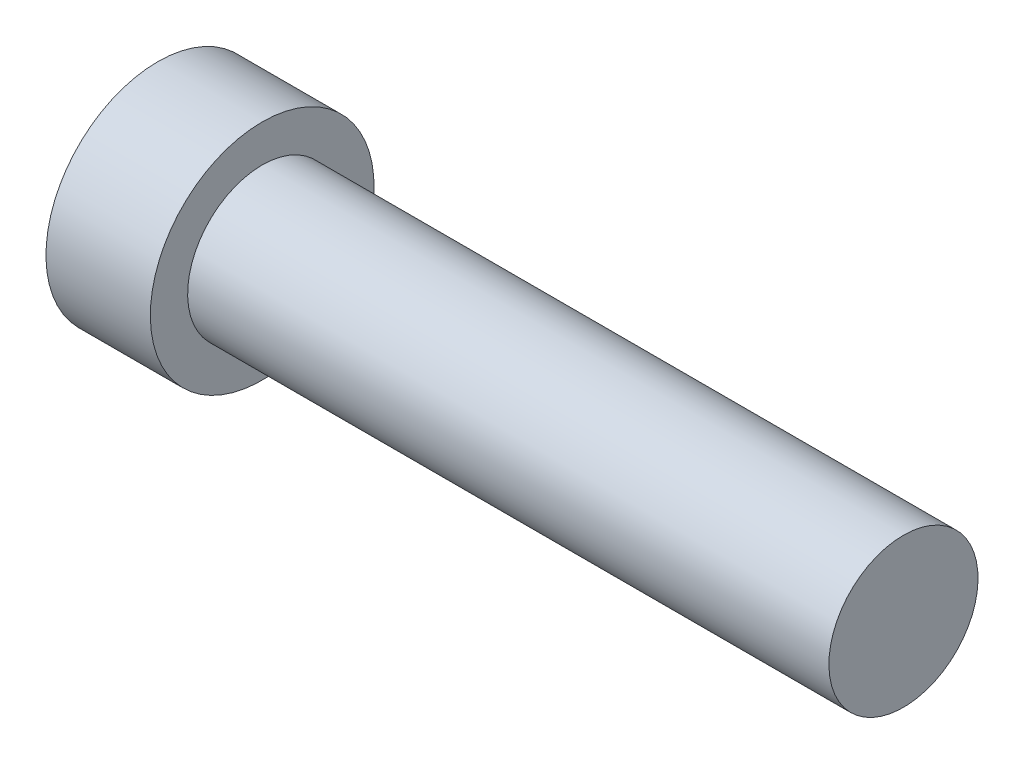
ISO-10303-21;
HEADER;
FILE_DESCRIPTION(('STEP AP214'),'2;1');
FILE_NAME('part.step','',(''),(''),'','','');
FILE_SCHEMA(('AUTOMOTIVE_DESIGN { 1 0 10303 214 1 1 1 1 }'));
ENDSEC;
DATA;
#1=APPLICATION_CONTEXT('core data for automotive mechanical design processes');
#2=APPLICATION_PROTOCOL_DEFINITION('international standard','automotive_design',2000,#1);
#3=PRODUCT_CONTEXT('',#1,'mechanical');
#4=PRODUCT('Part','Part','',(#3));
#5=PRODUCT_RELATED_PRODUCT_CATEGORY('part','',(#4));
#6=PRODUCT_DEFINITION_FORMATION('','',#4);
#7=PRODUCT_DEFINITION_CONTEXT('part definition',#1,'design');
#8=PRODUCT_DEFINITION('design','',#6,#7);
#9=PRODUCT_DEFINITION_SHAPE('','',#8);
#10=(LENGTH_UNIT() NAMED_UNIT(*) SI_UNIT(.MILLI.,.METRE.));
#11=(NAMED_UNIT(*) PLANE_ANGLE_UNIT() SI_UNIT($,.RADIAN.));
#12=(NAMED_UNIT(*) SI_UNIT($,.STERADIAN.) SOLID_ANGLE_UNIT());
#13=UNCERTAINTY_MEASURE_WITH_UNIT(LENGTH_MEASURE(1.E-05),#10,'distance_accuracy_value','');
#14=(GEOMETRIC_REPRESENTATION_CONTEXT(3) GLOBAL_UNCERTAINTY_ASSIGNED_CONTEXT((#13)) GLOBAL_UNIT_ASSIGNED_CONTEXT((#10,
#11,#12)) REPRESENTATION_CONTEXT('',''));
#15=CARTESIAN_POINT('',(0.,0.,0.));
#16=DIRECTION('',(0.,0.,1.));
#17=DIRECTION('',(1.,0.,0.));
#18=AXIS2_PLACEMENT_3D('',#15,#16,#17);
#19=CARTESIAN_POINT('',(50.,0.,0.));
#20=DIRECTION('',(-1.,0.,0.));
#21=DIRECTION('',(0.,-1.,0.));
#22=AXIS2_PLACEMENT_3D('',#19,#20,#21);
#23=PLANE('',#22);
#24=CARTESIAN_POINT('',(50.,0.,0.));
#25=DIRECTION('',(1.,0.,0.));
#26=DIRECTION('',(0.,1.,0.));
#27=AXIS2_PLACEMENT_3D('',#24,#25,#26);
#28=CIRCLE('',#27,5.);
#29=CARTESIAN_POINT('',(50.,5.00000000000001,0.));
#30=VERTEX_POINT('',#29);
#31=EDGE_CURVE('E10',#30,#30,#28,.T.);
#32=ORIENTED_EDGE('',*,*,#31,.T.);
#33=EDGE_LOOP('',(#32));
#34=FACE_BOUND('',#33,.T.);
#35=ADVANCED_FACE('F39',(#34),#23,.F.);
#36=CARTESIAN_POINT('',(50.,0.,0.));
#37=DIRECTION('',(1.,0.,0.));
#38=DIRECTION('',(0.,1.,0.));
#39=AXIS2_PLACEMENT_3D('',#36,#37,#38);
#40=CYLINDRICAL_SURFACE('',#39,5.);
#41=ORIENTED_EDGE('',*,*,#31,.F.);
#42=EDGE_LOOP('',(#41));
#43=FACE_BOUND('',#42,.T.);
#44=CARTESIAN_POINT('',(7.,0.,0.));
#45=DIRECTION('',(1.,0.,0.));
#46=DIRECTION('',(0.,1.,0.));
#47=AXIS2_PLACEMENT_3D('',#44,#45,#46);
#48=CIRCLE('',#47,5.00000000000001);
#49=CARTESIAN_POINT('',(7.,5.00000000000001,0.));
#50=VERTEX_POINT('',#49);
#51=EDGE_CURVE('E46',#50,#50,#48,.T.);
#52=ORIENTED_EDGE('',*,*,#51,.T.);
#53=EDGE_LOOP('',(#52));
#54=FACE_BOUND('',#53,.T.);
#55=ADVANCED_FACE('F75',(#43,#54),#40,.T.);
#56=CARTESIAN_POINT('',(7.,0.,0.));
#57=DIRECTION('',(-1.,0.,0.));
#58=DIRECTION('',(0.,-1.,0.));
#59=AXIS2_PLACEMENT_3D('',#56,#57,#58);
#60=PLANE('',#59);
#61=ORIENTED_EDGE('',*,*,#51,.F.);
#62=EDGE_LOOP('',(#61));
#63=FACE_BOUND('',#62,.T.);
#64=CARTESIAN_POINT('',(7.00000000000001,0.,0.));
#65=DIRECTION('',(1.,0.,0.));
#66=DIRECTION('',(0.,1.,0.));
#67=AXIS2_PLACEMENT_3D('',#64,#65,#66);
#68=CIRCLE('',#67,7.5);
#69=CARTESIAN_POINT('',(7.00000000000001,7.5,0.));
#70=VERTEX_POINT('',#69);
#71=EDGE_CURVE('E51',#70,#70,#68,.T.);
#72=ORIENTED_EDGE('',*,*,#71,.T.);
#73=EDGE_LOOP('',(#72));
#74=FACE_BOUND('',#73,.T.);
#75=ADVANCED_FACE('F71',(#63,#74),#60,.F.);
#76=CARTESIAN_POINT('',(50.,0.,0.));
#77=DIRECTION('',(1.,0.,0.));
#78=DIRECTION('',(0.,1.,0.));
#79=AXIS2_PLACEMENT_3D('',#76,#77,#78);
#80=CYLINDRICAL_SURFACE('',#79,7.5);
#81=ORIENTED_EDGE('',*,*,#71,.F.);
#82=EDGE_LOOP('',(#81));
#83=FACE_BOUND('',#82,.T.);
#84=CARTESIAN_POINT('',(0.,0.,0.));
#85=DIRECTION('',(1.,0.,0.));
#86=DIRECTION('',(0.,1.,0.));
#87=AXIS2_PLACEMENT_3D('',#84,#85,#86);
#88=CIRCLE('',#87,7.5);
#89=CARTESIAN_POINT('',(0.,7.5,0.));
#90=VERTEX_POINT('',#89);
#91=EDGE_CURVE('E56',#90,#90,#88,.T.);
#92=ORIENTED_EDGE('',*,*,#91,.T.);
#93=EDGE_LOOP('',(#92));
#94=FACE_BOUND('',#93,.T.);
#95=ADVANCED_FACE('F63',(#83,#94),#80,.T.);
#96=CARTESIAN_POINT('',(0.,0.,0.));
#97=DIRECTION('',(1.,0.,0.));
#98=DIRECTION('',(0.,1.,0.));
#99=AXIS2_PLACEMENT_3D('',#96,#97,#98);
#100=PLANE('',#99);
#101=ORIENTED_EDGE('',*,*,#91,.F.);
#102=EDGE_LOOP('',(#101));
#103=FACE_BOUND('',#102,.T.);
#104=ADVANCED_FACE('F65',(#103),#100,.F.);
#105=CLOSED_SHELL('',(#35,#55,#75,#95,#104));
#106=MANIFOLD_SOLID_BREP('B2',#105);
#107=ADVANCED_BREP_SHAPE_REPRESENTATION('',(#18,#106),#14);
#108=SHAPE_DEFINITION_REPRESENTATION(#9,#107);
ENDSEC;
END-ISO-10303-21;
